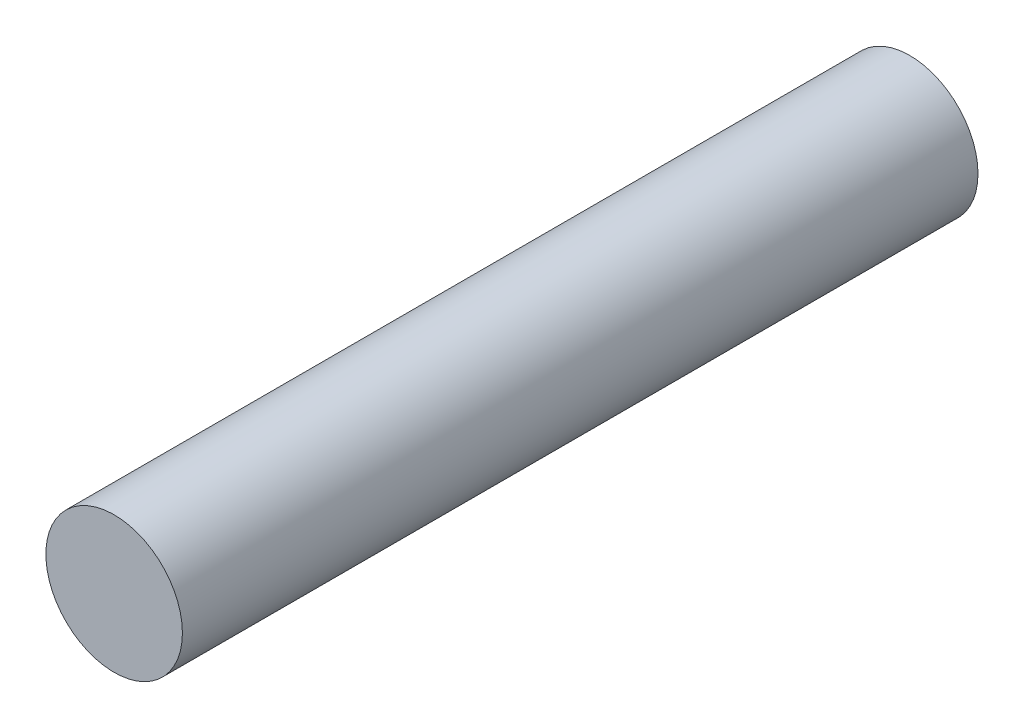
ISO-10303-21;
HEADER;
FILE_DESCRIPTION(('STEP AP214'),'2;1');
FILE_NAME('part.step','',(''),(''),'','','');
FILE_SCHEMA(('AUTOMOTIVE_DESIGN { 1 0 10303 214 1 1 1 1 }'));
ENDSEC;
DATA;
#1=APPLICATION_CONTEXT('core data for automotive mechanical design processes');
#2=APPLICATION_PROTOCOL_DEFINITION('international standard','automotive_design',2000,#1);
#3=PRODUCT_CONTEXT('',#1,'mechanical');
#4=PRODUCT('Part','Part','',(#3));
#5=PRODUCT_RELATED_PRODUCT_CATEGORY('part','',(#4));
#6=PRODUCT_DEFINITION_FORMATION('','',#4);
#7=PRODUCT_DEFINITION_CONTEXT('part definition',#1,'design');
#8=PRODUCT_DEFINITION('design','',#6,#7);
#9=PRODUCT_DEFINITION_SHAPE('','',#8);
#10=(LENGTH_UNIT() NAMED_UNIT(*) SI_UNIT(.MILLI.,.METRE.));
#11=(NAMED_UNIT(*) PLANE_ANGLE_UNIT() SI_UNIT($,.RADIAN.));
#12=(NAMED_UNIT(*) SI_UNIT($,.STERADIAN.) SOLID_ANGLE_UNIT());
#13=UNCERTAINTY_MEASURE_WITH_UNIT(LENGTH_MEASURE(1.E-05),#10,'distance_accuracy_value','');
#14=(GEOMETRIC_REPRESENTATION_CONTEXT(3) GLOBAL_UNCERTAINTY_ASSIGNED_CONTEXT((#13)) GLOBAL_UNIT_ASSIGNED_CONTEXT((#10,
#11,#12)) REPRESENTATION_CONTEXT('',''));
#15=CARTESIAN_POINT('',(0.,0.,0.));
#16=DIRECTION('',(0.,0.,1.));
#17=DIRECTION('',(1.,0.,0.));
#18=AXIS2_PLACEMENT_3D('',#15,#16,#17);
#19=CARTESIAN_POINT('',(0.,0.,18.5));
#20=DIRECTION('',(0.,0.,-1.));
#21=DIRECTION('',(-1.,0.,0.));
#22=AXIS2_PLACEMENT_3D('',#19,#20,#21);
#23=CYLINDRICAL_SURFACE('',#22,3.175);
#24=CARTESIAN_POINT('',(0.,0.,18.5));
#25=DIRECTION('',(0.,0.,1.));
#26=DIRECTION('',(1.,0.,0.));
#27=AXIS2_PLACEMENT_3D('',#24,#25,#26);
#28=CIRCLE('',#27,3.175);
#29=CARTESIAN_POINT('',(3.175,0.,18.5));
#30=VERTEX_POINT('',#29);
#31=EDGE_CURVE('E10',#30,#30,#28,.T.);
#32=ORIENTED_EDGE('',*,*,#31,.F.);
#33=EDGE_LOOP('',(#32));
#34=FACE_BOUND('',#33,.T.);
#35=CARTESIAN_POINT('',(0.,0.,-18.5));
#36=DIRECTION('',(0.,0.,1.));
#37=DIRECTION('',(1.,0.,0.));
#38=AXIS2_PLACEMENT_3D('',#35,#36,#37);
#39=CIRCLE('',#38,3.175);
#40=CARTESIAN_POINT('',(3.175,0.,-18.5));
#41=VERTEX_POINT('',#40);
#42=EDGE_CURVE('E40',#41,#41,#39,.T.);
#43=ORIENTED_EDGE('',*,*,#42,.T.);
#44=EDGE_LOOP('',(#43));
#45=FACE_BOUND('',#44,.T.);
#46=ADVANCED_FACE('F37',(#34,#45),#23,.T.);
#47=CARTESIAN_POINT('',(0.,0.,18.5));
#48=DIRECTION('',(0.,0.,1.));
#49=DIRECTION('',(1.,0.,0.));
#50=AXIS2_PLACEMENT_3D('',#47,#48,#49);
#51=PLANE('',#50);
#52=ORIENTED_EDGE('',*,*,#31,.T.);
#53=EDGE_LOOP('',(#52));
#54=FACE_BOUND('',#53,.T.);
#55=ADVANCED_FACE('F54',(#54),#51,.T.);
#56=CARTESIAN_POINT('',(0.,0.,-18.5));
#57=DIRECTION('',(0.,0.,1.));
#58=DIRECTION('',(1.,0.,0.));
#59=AXIS2_PLACEMENT_3D('',#56,#57,#58);
#60=PLANE('',#59);
#61=ORIENTED_EDGE('',*,*,#42,.F.);
#62=EDGE_LOOP('',(#61));
#63=FACE_BOUND('',#62,.T.);
#64=ADVANCED_FACE('F52',(#63),#60,.F.);
#65=CLOSED_SHELL('',(#46,#55,#64));
#66=MANIFOLD_SOLID_BREP('B2',#65);
#67=ADVANCED_BREP_SHAPE_REPRESENTATION('',(#18,#66),#14);
#68=SHAPE_DEFINITION_REPRESENTATION(#9,#67);
ENDSEC;
END-ISO-10303-21;
